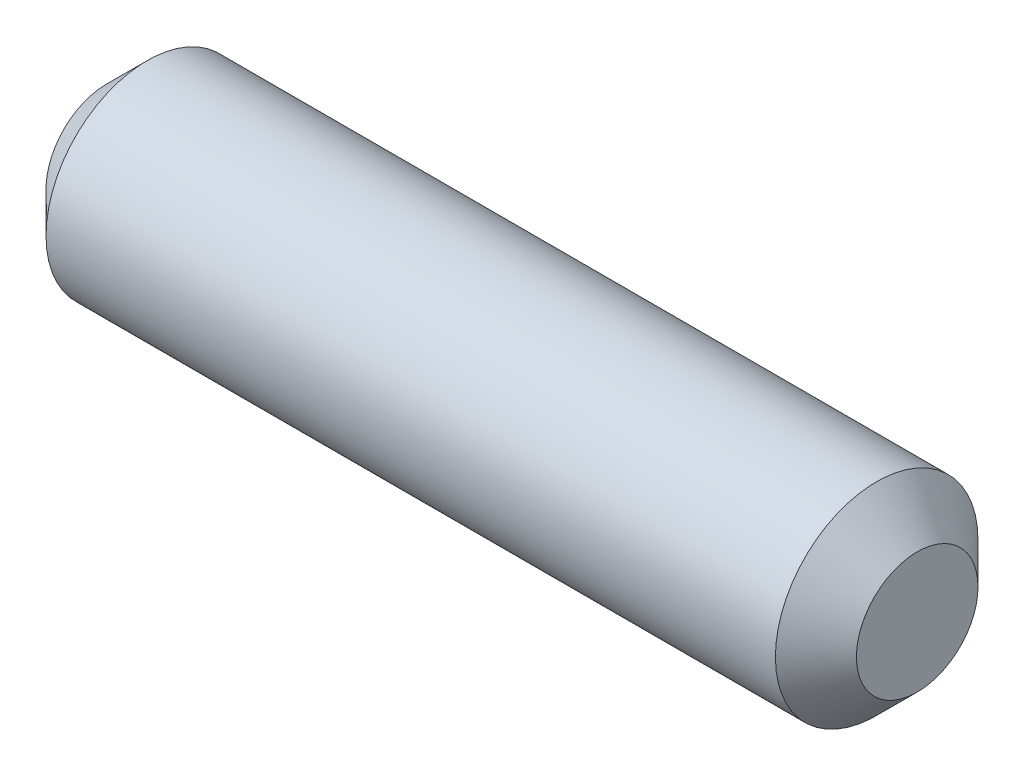
ISO-10303-21;
HEADER;
FILE_DESCRIPTION(('STEP AP214'),'2;1');
FILE_NAME('part.step','',(''),(''),'','','');
FILE_SCHEMA(('AUTOMOTIVE_DESIGN { 1 0 10303 214 1 1 1 1 }'));
ENDSEC;
DATA;
#1=APPLICATION_CONTEXT('core data for automotive mechanical design processes');
#2=APPLICATION_PROTOCOL_DEFINITION('international standard','automotive_design',2000,#1);
#3=PRODUCT_CONTEXT('',#1,'mechanical');
#4=PRODUCT('Part','Part','',(#3));
#5=PRODUCT_RELATED_PRODUCT_CATEGORY('part','',(#4));
#6=PRODUCT_DEFINITION_FORMATION('','',#4);
#7=PRODUCT_DEFINITION_CONTEXT('part definition',#1,'design');
#8=PRODUCT_DEFINITION('design','',#6,#7);
#9=PRODUCT_DEFINITION_SHAPE('','',#8);
#10=(LENGTH_UNIT() NAMED_UNIT(*) SI_UNIT(.MILLI.,.METRE.));
#11=(NAMED_UNIT(*) PLANE_ANGLE_UNIT() SI_UNIT($,.RADIAN.));
#12=(NAMED_UNIT(*) SI_UNIT($,.STERADIAN.) SOLID_ANGLE_UNIT());
#13=UNCERTAINTY_MEASURE_WITH_UNIT(LENGTH_MEASURE(1.E-05),#10,'distance_accuracy_value','');
#14=(GEOMETRIC_REPRESENTATION_CONTEXT(3) GLOBAL_UNCERTAINTY_ASSIGNED_CONTEXT((#13)) GLOBAL_UNIT_ASSIGNED_CONTEXT((#10,
#11,#12)) REPRESENTATION_CONTEXT('',''));
#15=CARTESIAN_POINT('',(0.,0.,0.));
#16=DIRECTION('',(0.,0.,1.));
#17=DIRECTION('',(1.,0.,0.));
#18=AXIS2_PLACEMENT_3D('',#15,#16,#17);
#19=CARTESIAN_POINT('',(10.,0.,0.));
#20=DIRECTION('',(-1.,0.,0.));
#21=DIRECTION('',(0.,0.,1.));
#22=AXIS2_PLACEMENT_3D('',#19,#20,#21);
#23=CYLINDRICAL_SURFACE('',#22,1.25);
#24=CARTESIAN_POINT('',(9.5,0.,0.));
#25=DIRECTION('',(1.,0.,0.));
#26=DIRECTION('',(0.,0.,-1.));
#27=AXIS2_PLACEMENT_3D('',#24,#25,#26);
#28=CIRCLE('',#27,1.25);
#29=CARTESIAN_POINT('',(9.5,0.,-1.25));
#30=VERTEX_POINT('',#29);
#31=EDGE_CURVE('E41',#30,#30,#28,.F.);
#32=ORIENTED_EDGE('',*,*,#31,.T.);
#33=EDGE_LOOP('',(#32));
#34=FACE_BOUND('',#33,.T.);
#35=CARTESIAN_POINT('',(0.500000000000002,0.,0.));
#36=DIRECTION('',(1.,0.,0.));
#37=DIRECTION('',(0.,0.,-1.));
#38=AXIS2_PLACEMENT_3D('',#35,#36,#37);
#39=CIRCLE('',#38,1.25);
#40=CARTESIAN_POINT('',(0.500000000000002,0.,-1.25));
#41=VERTEX_POINT('',#40);
#42=EDGE_CURVE('E45',#41,#41,#39,.T.);
#43=ORIENTED_EDGE('',*,*,#42,.T.);
#44=EDGE_LOOP('',(#43));
#45=FACE_BOUND('',#44,.T.);
#46=ADVANCED_FACE('F33',(#34,#45),#23,.T.);
#47=CARTESIAN_POINT('',(10.,0.,0.));
#48=DIRECTION('',(1.,0.,0.));
#49=DIRECTION('',(0.,0.,-1.));
#50=AXIS2_PLACEMENT_3D('',#47,#48,#49);
#51=PLANE('',#50);
#52=CARTESIAN_POINT('',(10.,0.,0.));
#53=DIRECTION('',(1.,0.,0.));
#54=DIRECTION('',(0.,0.,-1.));
#55=AXIS2_PLACEMENT_3D('',#52,#53,#54);
#56=CIRCLE('',#55,0.749999999999995);
#57=CARTESIAN_POINT('',(10.,0.,-0.749999999999995));
#58=VERTEX_POINT('',#57);
#59=EDGE_CURVE('E49',#58,#58,#56,.T.);
#60=ORIENTED_EDGE('',*,*,#59,.T.);
#61=EDGE_LOOP('',(#60));
#62=FACE_BOUND('',#61,.T.);
#63=ADVANCED_FACE('F55',(#62),#51,.T.);
#64=CARTESIAN_POINT('',(0.,0.,0.));
#65=DIRECTION('',(1.,0.,0.));
#66=DIRECTION('',(0.,0.,-1.));
#67=AXIS2_PLACEMENT_3D('',#64,#65,#66);
#68=PLANE('',#67);
#69=CARTESIAN_POINT('',(0.,0.,0.));
#70=DIRECTION('',(1.,0.,0.));
#71=DIRECTION('',(0.,0.,-1.));
#72=AXIS2_PLACEMENT_3D('',#69,#70,#71);
#73=CIRCLE('',#72,0.749999999999997);
#74=CARTESIAN_POINT('',(0.,0.,-0.749999999999997));
#75=VERTEX_POINT('',#74);
#76=EDGE_CURVE('E10',#75,#75,#73,.F.);
#77=ORIENTED_EDGE('',*,*,#76,.T.);
#78=EDGE_LOOP('',(#77));
#79=FACE_BOUND('',#78,.T.);
#80=ADVANCED_FACE('F59',(#79),#68,.F.);
#81=CARTESIAN_POINT('',(10.,0.,0.));
#82=DIRECTION('',(-1.,0.,0.));
#83=DIRECTION('',(0.,0.,1.));
#84=AXIS2_PLACEMENT_3D('',#81,#82,#83);
#85=CONICAL_SURFACE('',#84,0.749999999999995,0.785398163397449);
#86=ORIENTED_EDGE('',*,*,#31,.F.);
#87=EDGE_LOOP('',(#86));
#88=FACE_BOUND('',#87,.T.);
#89=ORIENTED_EDGE('',*,*,#59,.F.);
#90=EDGE_LOOP('',(#89));
#91=FACE_BOUND('',#90,.T.);
#92=ADVANCED_FACE('F57',(#88,#91),#85,.T.);
#93=CARTESIAN_POINT('',(0.500000000000002,0.,0.));
#94=DIRECTION('',(1.,0.,0.));
#95=DIRECTION('',(0.,0.,-1.));
#96=AXIS2_PLACEMENT_3D('',#93,#94,#95);
#97=CONICAL_SURFACE('',#96,1.25,0.785398163397449);
#98=ORIENTED_EDGE('',*,*,#76,.F.);
#99=EDGE_LOOP('',(#98));
#100=FACE_BOUND('',#99,.T.);
#101=ORIENTED_EDGE('',*,*,#42,.F.);
#102=EDGE_LOOP('',(#101));
#103=FACE_BOUND('',#102,.T.);
#104=ADVANCED_FACE('F36',(#100,#103),#97,.T.);
#105=CLOSED_SHELL('',(#46,#63,#80,#92,#104));
#106=MANIFOLD_SOLID_BREP('B2',#105);
#107=ADVANCED_BREP_SHAPE_REPRESENTATION('',(#18,#106),#14);
#108=SHAPE_DEFINITION_REPRESENTATION(#9,#107);
ENDSEC;
END-ISO-10303-21;
